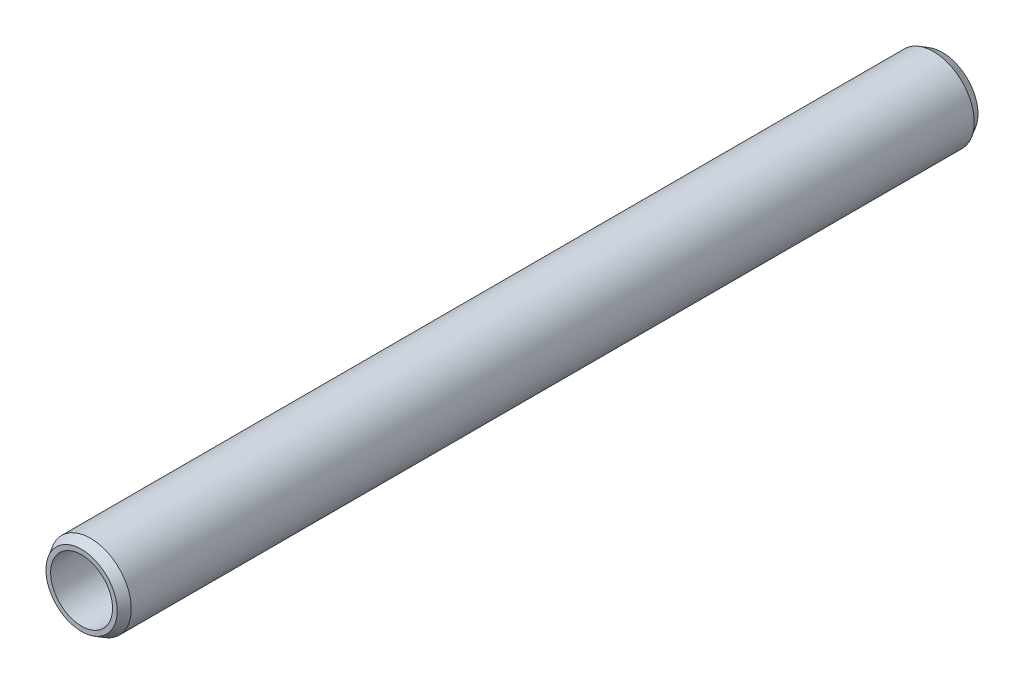
ISO-10303-21;
HEADER;
FILE_DESCRIPTION(('STEP AP214'),'2;1');
FILE_NAME('part.step','',(''),(''),'','','');
FILE_SCHEMA(('AUTOMOTIVE_DESIGN { 1 0 10303 214 1 1 1 1 }'));
ENDSEC;
DATA;
#1=APPLICATION_CONTEXT('core data for automotive mechanical design processes');
#2=APPLICATION_PROTOCOL_DEFINITION('international standard','automotive_design',2000,#1);
#3=PRODUCT_CONTEXT('',#1,'mechanical');
#4=PRODUCT('Part','Part','',(#3));
#5=PRODUCT_RELATED_PRODUCT_CATEGORY('part','',(#4));
#6=PRODUCT_DEFINITION_FORMATION('','',#4);
#7=PRODUCT_DEFINITION_CONTEXT('part definition',#1,'design');
#8=PRODUCT_DEFINITION('design','',#6,#7);
#9=PRODUCT_DEFINITION_SHAPE('','',#8);
#10=(LENGTH_UNIT() NAMED_UNIT(*) SI_UNIT(.MILLI.,.METRE.));
#11=(NAMED_UNIT(*) PLANE_ANGLE_UNIT() SI_UNIT($,.RADIAN.));
#12=(NAMED_UNIT(*) SI_UNIT($,.STERADIAN.) SOLID_ANGLE_UNIT());
#13=UNCERTAINTY_MEASURE_WITH_UNIT(LENGTH_MEASURE(1.E-05),#10,'distance_accuracy_value','');
#14=(GEOMETRIC_REPRESENTATION_CONTEXT(3) GLOBAL_UNCERTAINTY_ASSIGNED_CONTEXT((#13)) GLOBAL_UNIT_ASSIGNED_CONTEXT((#10,
#11,#12)) REPRESENTATION_CONTEXT('',''));
#15=CARTESIAN_POINT('',(0.,0.,0.));
#16=DIRECTION('',(0.,0.,1.));
#17=DIRECTION('',(1.,0.,0.));
#18=AXIS2_PLACEMENT_3D('',#15,#16,#17);
#19=CARTESIAN_POINT('',(0.,0.,72.3));
#20=DIRECTION('',(0.,0.,1.));
#21=DIRECTION('',(1.,0.,0.));
#22=AXIS2_PLACEMENT_3D('',#19,#20,#21);
#23=PLANE('',#22);
#24=CARTESIAN_POINT('',(0.,0.,72.3));
#25=DIRECTION('',(0.,0.,1.));
#26=DIRECTION('',(1.,0.,0.));
#27=AXIS2_PLACEMENT_3D('',#24,#25,#26);
#28=CIRCLE('',#27,5.98397459621554);
#29=CARTESIAN_POINT('',(5.98397459621554,0.,72.3));
#30=VERTEX_POINT('',#29);
#31=EDGE_CURVE('E40',#30,#30,#28,.T.);
#32=ORIENTED_EDGE('',*,*,#31,.T.);
#33=EDGE_LOOP('',(#32));
#34=FACE_BOUND('',#33,.T.);
#35=CARTESIAN_POINT('',(0.,0.,72.3));
#36=DIRECTION('',(0.,0.,1.));
#37=DIRECTION('',(1.,0.,0.));
#38=AXIS2_PLACEMENT_3D('',#35,#36,#37);
#39=CIRCLE('',#38,5.2);
#40=CARTESIAN_POINT('',(5.2,0.,72.3));
#41=VERTEX_POINT('',#40);
#42=EDGE_CURVE('E53',#41,#41,#39,.T.);
#43=ORIENTED_EDGE('',*,*,#42,.F.);
#44=EDGE_LOOP('',(#43));
#45=FACE_BOUND('',#44,.T.);
#46=ADVANCED_FACE('F33',(#34,#45),#23,.T.);
#47=CARTESIAN_POINT('',(0.,0.,-72.3));
#48=DIRECTION('',(0.,0.,1.));
#49=DIRECTION('',(1.,0.,0.));
#50=AXIS2_PLACEMENT_3D('',#47,#48,#49);
#51=PLANE('',#50);
#52=CARTESIAN_POINT('',(0.,0.,-72.3));
#53=DIRECTION('',(0.,0.,1.));
#54=DIRECTION('',(1.,0.,0.));
#55=AXIS2_PLACEMENT_3D('',#52,#53,#54);
#56=CIRCLE('',#55,5.98397459621554);
#57=CARTESIAN_POINT('',(5.98397459621554,0.,-72.3));
#58=VERTEX_POINT('',#57);
#59=EDGE_CURVE('E44',#58,#58,#56,.F.);
#60=ORIENTED_EDGE('',*,*,#59,.T.);
#61=EDGE_LOOP('',(#60));
#62=FACE_BOUND('',#61,.T.);
#63=CARTESIAN_POINT('',(0.,0.,-72.3));
#64=DIRECTION('',(0.,0.,1.));
#65=DIRECTION('',(1.,0.,0.));
#66=AXIS2_PLACEMENT_3D('',#63,#64,#65);
#67=CIRCLE('',#66,5.2);
#68=CARTESIAN_POINT('',(5.2,0.,-72.3));
#69=VERTEX_POINT('',#68);
#70=EDGE_CURVE('E56',#69,#69,#67,.T.);
#71=ORIENTED_EDGE('',*,*,#70,.T.);
#72=EDGE_LOOP('',(#71));
#73=FACE_BOUND('',#72,.T.);
#74=ADVANCED_FACE('F60',(#62,#73),#51,.F.);
#75=CARTESIAN_POINT('',(0.,0.,72.3));
#76=DIRECTION('',(0.,0.,-1.));
#77=DIRECTION('',(-1.,0.,0.));
#78=AXIS2_PLACEMENT_3D('',#75,#76,#77);
#79=CYLINDRICAL_SURFACE('',#78,6.85);
#80=CARTESIAN_POINT('',(0.,0.,70.8));
#81=DIRECTION('',(0.,0.,1.));
#82=DIRECTION('',(1.,0.,0.));
#83=AXIS2_PLACEMENT_3D('',#80,#81,#82);
#84=CIRCLE('',#83,6.85);
#85=CARTESIAN_POINT('',(6.85,0.,70.8));
#86=VERTEX_POINT('',#85);
#87=EDGE_CURVE('E10',#86,#86,#84,.F.);
#88=ORIENTED_EDGE('',*,*,#87,.T.);
#89=EDGE_LOOP('',(#88));
#90=FACE_BOUND('',#89,.T.);
#91=CARTESIAN_POINT('',(0.,0.,-70.8));
#92=DIRECTION('',(0.,0.,1.));
#93=DIRECTION('',(1.,0.,0.));
#94=AXIS2_PLACEMENT_3D('',#91,#92,#93);
#95=CIRCLE('',#94,6.85);
#96=CARTESIAN_POINT('',(6.85,0.,-70.8));
#97=VERTEX_POINT('',#96);
#98=EDGE_CURVE('E48',#97,#97,#95,.T.);
#99=ORIENTED_EDGE('',*,*,#98,.T.);
#100=EDGE_LOOP('',(#99));
#101=FACE_BOUND('',#100,.T.);
#102=ADVANCED_FACE('F35',(#90,#101),#79,.T.);
#103=CARTESIAN_POINT('',(0.,0.,72.3));
#104=DIRECTION('',(0.,0.,-1.));
#105=DIRECTION('',(-1.,0.,0.));
#106=AXIS2_PLACEMENT_3D('',#103,#104,#105);
#107=CYLINDRICAL_SURFACE('',#106,5.2);
#108=ORIENTED_EDGE('',*,*,#42,.T.);
#109=EDGE_LOOP('',(#108));
#110=FACE_BOUND('',#109,.T.);
#111=ORIENTED_EDGE('',*,*,#70,.F.);
#112=EDGE_LOOP('',(#111));
#113=FACE_BOUND('',#112,.T.);
#114=ADVANCED_FACE('F62',(#110,#113),#107,.F.);
#115=CARTESIAN_POINT('',(0.,0.,-70.8));
#116=DIRECTION('',(0.,0.,1.));
#117=DIRECTION('',(1.,0.,0.));
#118=AXIS2_PLACEMENT_3D('',#115,#116,#117);
#119=CONICAL_SURFACE('',#118,6.85,0.523598775598307);
#120=ORIENTED_EDGE('',*,*,#59,.F.);
#121=EDGE_LOOP('',(#120));
#122=FACE_BOUND('',#121,.T.);
#123=ORIENTED_EDGE('',*,*,#98,.F.);
#124=EDGE_LOOP('',(#123));
#125=FACE_BOUND('',#124,.T.);
#126=ADVANCED_FACE('F64',(#122,#125),#119,.T.);
#127=CARTESIAN_POINT('',(0.,0.,72.3));
#128=DIRECTION('',(0.,0.,-1.));
#129=DIRECTION('',(-1.,0.,0.));
#130=AXIS2_PLACEMENT_3D('',#127,#128,#129);
#131=CONICAL_SURFACE('',#130,5.98397459621554,0.523598775598307);
#132=ORIENTED_EDGE('',*,*,#87,.F.);
#133=EDGE_LOOP('',(#132));
#134=FACE_BOUND('',#133,.T.);
#135=ORIENTED_EDGE('',*,*,#31,.F.);
#136=EDGE_LOOP('',(#135));
#137=FACE_BOUND('',#136,.T.);
#138=ADVANCED_FACE('F71',(#134,#137),#131,.T.);
#139=CLOSED_SHELL('',(#46,#74,#102,#114,#126,#138));
#140=MANIFOLD_SOLID_BREP('B2',#139);
#141=ADVANCED_BREP_SHAPE_REPRESENTATION('',(#18,#140),#14);
#142=SHAPE_DEFINITION_REPRESENTATION(#9,#141);
ENDSEC;
END-ISO-10303-21;
